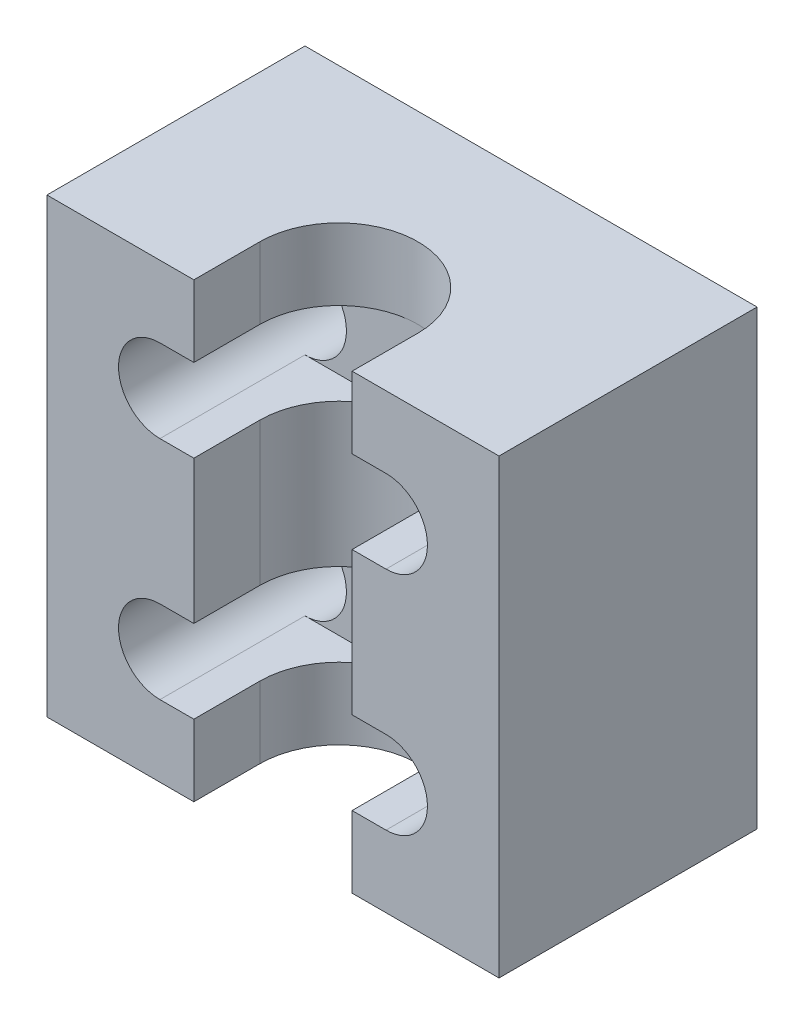
ISO-10303-21;
HEADER;
FILE_DESCRIPTION(('STEP AP214'),'2;1');
FILE_NAME('part.step','',(''),(''),'','','');
FILE_SCHEMA(('AUTOMOTIVE_DESIGN { 1 0 10303 214 1 1 1 1 }'));
ENDSEC;
DATA;
#1=APPLICATION_CONTEXT('core data for automotive mechanical design processes');
#2=APPLICATION_PROTOCOL_DEFINITION('international standard','automotive_design',2000,#1);
#3=PRODUCT_CONTEXT('',#1,'mechanical');
#4=PRODUCT('Part','Part','',(#3));
#5=PRODUCT_RELATED_PRODUCT_CATEGORY('part','',(#4));
#6=PRODUCT_DEFINITION_FORMATION('','',#4);
#7=PRODUCT_DEFINITION_CONTEXT('part definition',#1,'design');
#8=PRODUCT_DEFINITION('design','',#6,#7);
#9=PRODUCT_DEFINITION_SHAPE('','',#8);
#10=(LENGTH_UNIT() NAMED_UNIT(*) SI_UNIT(.MILLI.,.METRE.));
#11=(NAMED_UNIT(*) PLANE_ANGLE_UNIT() SI_UNIT($,.RADIAN.));
#12=(NAMED_UNIT(*) SI_UNIT($,.STERADIAN.) SOLID_ANGLE_UNIT());
#13=UNCERTAINTY_MEASURE_WITH_UNIT(LENGTH_MEASURE(1.E-05),#10,'distance_accuracy_value','');
#14=(GEOMETRIC_REPRESENTATION_CONTEXT(3) GLOBAL_UNCERTAINTY_ASSIGNED_CONTEXT((#13)) GLOBAL_UNIT_ASSIGNED_CONTEXT((#10,
#11,#12)) REPRESENTATION_CONTEXT('',''));
#15=CARTESIAN_POINT('',(0.,0.,0.));
#16=DIRECTION('',(0.,0.,1.));
#17=DIRECTION('',(1.,0.,0.));
#18=AXIS2_PLACEMENT_3D('',#15,#16,#17);
#19=CARTESIAN_POINT('',(25.5233260785874,-2.7,15.7));
#20=DIRECTION('',(0.,0.,1.));
#21=DIRECTION('',(1.,0.,0.));
#22=AXIS2_PLACEMENT_3D('',#19,#20,#21);
#23=PLANE('',#22);
#24=CARTESIAN_POINT('',(-6.,6.,15.7));
#25=DIRECTION('',(0.,0.,1.));
#26=DIRECTION('',(1.,0.,0.));
#27=AXIS2_PLACEMENT_3D('',#24,#25,#26);
#28=CIRCLE('',#27,2.2);
#29=CARTESIAN_POINT('',(-6.,8.2,15.7));
#30=VERTEX_POINT('',#29);
#31=CARTESIAN_POINT('',(-6.,3.8,15.7));
#32=VERTEX_POINT('',#31);
#33=EDGE_CURVE('E391',#30,#32,#28,.T.);
#34=ORIENTED_EDGE('',*,*,#33,.F.);
#35=DIRECTION('',(-1.,0.,0.));
#36=VECTOR('',#35,1.);
#37=CARTESIAN_POINT('',(6.,8.2,15.7));
#38=LINE('',#37,#36);
#39=CARTESIAN_POINT('',(-4.2,8.2,15.7));
#40=VERTEX_POINT('',#39);
#41=EDGE_CURVE('E283',#40,#30,#38,.T.);
#42=ORIENTED_EDGE('',*,*,#41,.F.);
#43=DIRECTION('',(0.,1.,0.));
#44=VECTOR('',#43,1.);
#45=CARTESIAN_POINT('',(-4.2,-12.001,15.7));
#46=LINE('',#45,#44);
#47=CARTESIAN_POINT('',(-4.2,12.,15.7));
#48=VERTEX_POINT('',#47);
#49=EDGE_CURVE('E74',#40,#48,#46,.T.);
#50=ORIENTED_EDGE('',*,*,#49,.T.);
#51=DIRECTION('',(1.,0.,0.));
#52=VECTOR('',#51,1.);
#53=CARTESIAN_POINT('',(-12.,12.,15.7));
#54=LINE('',#53,#52);
#55=CARTESIAN_POINT('',(-12.,12.,15.7));
#56=VERTEX_POINT('',#55);
#57=EDGE_CURVE('E338',#56,#48,#54,.T.);
#58=ORIENTED_EDGE('',*,*,#57,.F.);
#59=DIRECTION('',(0.,-1.,0.));
#60=VECTOR('',#59,1.);
#61=CARTESIAN_POINT('',(-12.,-10.7,15.7));
#62=LINE('',#61,#60);
#63=CARTESIAN_POINT('',(-12.,-12.,15.7));
#64=VERTEX_POINT('',#63);
#65=EDGE_CURVE('E327',#56,#64,#62,.T.);
#66=ORIENTED_EDGE('',*,*,#65,.T.);
#67=DIRECTION('',(1.,0.,0.));
#68=VECTOR('',#67,1.);
#69=CARTESIAN_POINT('',(12.,-12.,15.7));
#70=LINE('',#69,#68);
#71=CARTESIAN_POINT('',(-4.2,-12.,15.7));
#72=VERTEX_POINT('',#71);
#73=EDGE_CURVE('E331',#64,#72,#70,.T.);
#74=ORIENTED_EDGE('',*,*,#73,.T.);
#75=DIRECTION('',(0.,-1.,0.));
#76=VECTOR('',#75,1.);
#77=CARTESIAN_POINT('',(-4.2,12.001,15.7));
#78=LINE('',#77,#76);
#79=CARTESIAN_POINT('',(-4.2,-8.2,15.7));
#80=VERTEX_POINT('',#79);
#81=EDGE_CURVE('E430',#80,#72,#78,.T.);
#82=ORIENTED_EDGE('',*,*,#81,.F.);
#83=DIRECTION('',(1.,0.,0.));
#84=VECTOR('',#83,1.);
#85=CARTESIAN_POINT('',(-6.,-8.2,15.7));
#86=LINE('',#85,#84);
#87=CARTESIAN_POINT('',(-6.,-8.2,15.7));
#88=VERTEX_POINT('',#87);
#89=EDGE_CURVE('E257',#88,#80,#86,.T.);
#90=ORIENTED_EDGE('',*,*,#89,.F.);
#91=CARTESIAN_POINT('',(-6.,-6.,15.7));
#92=DIRECTION('',(0.,0.,-1.));
#93=DIRECTION('',(-1.,0.,0.));
#94=AXIS2_PLACEMENT_3D('',#91,#92,#93);
#95=CIRCLE('',#94,2.2);
#96=CARTESIAN_POINT('',(-6.,-3.8,15.7));
#97=VERTEX_POINT('',#96);
#98=EDGE_CURVE('E411',#88,#97,#95,.T.);
#99=ORIENTED_EDGE('',*,*,#98,.T.);
#100=DIRECTION('',(-1.,0.,0.));
#101=VECTOR('',#100,1.);
#102=CARTESIAN_POINT('',(-4.2,-3.8,15.7));
#103=LINE('',#102,#101);
#104=CARTESIAN_POINT('',(-4.2,-3.8,15.7));
#105=VERTEX_POINT('',#104);
#106=EDGE_CURVE('E252',#105,#97,#103,.T.);
#107=ORIENTED_EDGE('',*,*,#106,.F.);
#108=DIRECTION('',(0.,1.,0.));
#109=VECTOR('',#108,1.);
#110=CARTESIAN_POINT('',(-4.2,28.9536257995575,15.7));
#111=LINE('',#110,#109);
#112=CARTESIAN_POINT('',(-4.2,3.8,15.7));
#113=VERTEX_POINT('',#112);
#114=EDGE_CURVE('E59',#105,#113,#111,.T.);
#115=ORIENTED_EDGE('',*,*,#114,.T.);
#116=DIRECTION('',(1.,0.,0.));
#117=VECTOR('',#116,1.);
#118=CARTESIAN_POINT('',(4.2,3.8,15.7));
#119=LINE('',#118,#117);
#120=EDGE_CURVE('E281',#32,#113,#119,.T.);
#121=ORIENTED_EDGE('',*,*,#120,.F.);
#122=EDGE_LOOP('',(#34,#42,#50,#58,#66,#74,#82,#90,#99,#107,#115,#121));
#123=FACE_BOUND('',#122,.T.);
#124=ADVANCED_FACE('F50',(#123),#23,.T.);
#125=CARTESIAN_POINT('',(-6.,-8.2,12.2));
#126=DIRECTION('',(0.,-1.,0.));
#127=DIRECTION('',(1.,0.,0.));
#128=AXIS2_PLACEMENT_3D('',#125,#126,#127);
#129=PLANE('',#128);
#130=ORIENTED_EDGE('',*,*,#89,.T.);
#131=DIRECTION('',(0.,0.,1.));
#132=VECTOR('',#131,1.);
#133=CARTESIAN_POINT('',(-4.2,-8.2,15.7));
#134=LINE('',#133,#132);
#135=CARTESIAN_POINT('',(-4.2,-8.19999999999999,12.2));
#136=VERTEX_POINT('',#135);
#137=EDGE_CURVE('E414',#136,#80,#134,.T.);
#138=ORIENTED_EDGE('',*,*,#137,.F.);
#139=CARTESIAN_POINT('',(0.,-8.2,12.2));
#140=DIRECTION('',(0.,-1.,0.));
#141=DIRECTION('',(1.,0.,0.));
#142=AXIS2_PLACEMENT_3D('',#139,#140,#141);
#143=CIRCLE('',#142,4.2);
#144=CARTESIAN_POINT('',(0.,-8.2,8.));
#145=VERTEX_POINT('',#144);
#146=EDGE_CURVE('E427',#145,#136,#143,.F.);
#147=ORIENTED_EDGE('',*,*,#146,.F.);
#148=DIRECTION('',(1.,0.,0.));
#149=VECTOR('',#148,1.);
#150=CARTESIAN_POINT('',(-6.,-8.2,8.));
#151=LINE('',#150,#149);
#152=CARTESIAN_POINT('',(-6.,-8.2,8.));
#153=VERTEX_POINT('',#152);
#154=EDGE_CURVE('E461',#153,#145,#151,.T.);
#155=ORIENTED_EDGE('',*,*,#154,.F.);
#156=DIRECTION('',(0.,0.,1.));
#157=VECTOR('',#156,1.);
#158=CARTESIAN_POINT('',(-6.,-8.2,12.2));
#159=LINE('',#158,#157);
#160=EDGE_CURVE('E251',#153,#88,#159,.T.);
#161=ORIENTED_EDGE('',*,*,#160,.T.);
#162=EDGE_LOOP('',(#130,#138,#147,#155,#161));
#163=FACE_BOUND('',#162,.T.);
#164=ADVANCED_FACE('F482',(#163),#129,.F.);
#165=CARTESIAN_POINT('',(6.,8.2,12.2));
#166=DIRECTION('',(0.,1.,0.));
#167=DIRECTION('',(-1.,0.,0.));
#168=AXIS2_PLACEMENT_3D('',#165,#166,#167);
#169=PLANE('',#168);
#170=CARTESIAN_POINT('',(6.,8.2,15.7));
#171=VERTEX_POINT('',#170);
#172=CARTESIAN_POINT('',(4.2,8.19999999999999,15.7));
#173=VERTEX_POINT('',#172);
#174=EDGE_CURVE('E284',#171,#173,#38,.T.);
#175=ORIENTED_EDGE('',*,*,#174,.T.);
#176=DIRECTION('',(0.,0.,1.));
#177=VECTOR('',#176,1.);
#178=CARTESIAN_POINT('',(4.2,8.2,15.7));
#179=LINE('',#178,#177);
#180=CARTESIAN_POINT('',(4.2,8.19999999999999,12.2));
#181=VERTEX_POINT('',#180);
#182=EDGE_CURVE('E449',#181,#173,#179,.T.);
#183=ORIENTED_EDGE('',*,*,#182,.F.);
#184=CARTESIAN_POINT('',(0.,8.2,12.2));
#185=DIRECTION('',(0.,1.,0.));
#186=DIRECTION('',(-1.,0.,0.));
#187=AXIS2_PLACEMENT_3D('',#184,#185,#186);
#188=CIRCLE('',#187,4.2);
#189=CARTESIAN_POINT('',(0.,8.2,8.00000000000001));
#190=VERTEX_POINT('',#189);
#191=EDGE_CURVE('E451',#190,#181,#188,.F.);
#192=ORIENTED_EDGE('',*,*,#191,.F.);
#193=DIRECTION('',(-1.,0.,0.));
#194=VECTOR('',#193,1.);
#195=CARTESIAN_POINT('',(6.,8.2,8.));
#196=LINE('',#195,#194);
#197=CARTESIAN_POINT('',(6.,8.2,8.));
#198=VERTEX_POINT('',#197);
#199=EDGE_CURVE('E274',#198,#190,#196,.T.);
#200=ORIENTED_EDGE('',*,*,#199,.F.);
#201=DIRECTION('',(0.,0.,1.));
#202=VECTOR('',#201,1.);
#203=CARTESIAN_POINT('',(6.,8.2,12.2));
#204=LINE('',#203,#202);
#205=EDGE_CURVE('E291',#198,#171,#204,.T.);
#206=ORIENTED_EDGE('',*,*,#205,.T.);
#207=EDGE_LOOP('',(#175,#183,#192,#200,#206));
#208=FACE_BOUND('',#207,.T.);
#209=ADVANCED_FACE('F587',(#208),#169,.F.);
#210=CARTESIAN_POINT('',(0.,28.9536257995575,12.2));
#211=DIRECTION('',(0.,-1.,0.));
#212=DIRECTION('',(0.,0.,-1.));
#213=AXIS2_PLACEMENT_3D('',#210,#211,#212);
#214=CYLINDRICAL_SURFACE('',#213,4.2);
#215=DIRECTION('',(0.,-1.,0.));
#216=VECTOR('',#215,1.);
#217=CARTESIAN_POINT('',(-4.2,28.9536257995575,12.2));
#218=LINE('',#217,#216);
#219=CARTESIAN_POINT('',(-4.2,3.8,12.2));
#220=VERTEX_POINT('',#219);
#221=CARTESIAN_POINT('',(-4.2,-3.8,12.2));
#222=VERTEX_POINT('',#221);
#223=EDGE_CURVE('E350',#220,#222,#218,.T.);
#224=ORIENTED_EDGE('',*,*,#223,.T.);
#225=CARTESIAN_POINT('',(0.,-3.8,12.2));
#226=DIRECTION('',(0.,1.,0.));
#227=DIRECTION('',(0.,0.,1.));
#228=AXIS2_PLACEMENT_3D('',#225,#226,#227);
#229=CIRCLE('',#228,4.2);
#230=CARTESIAN_POINT('',(0.,-3.8,8.));
#231=VERTEX_POINT('',#230);
#232=EDGE_CURVE('E467',#222,#231,#229,.F.);
#233=ORIENTED_EDGE('',*,*,#232,.T.);
#234=CARTESIAN_POINT('',(0.,-3.8,12.2));
#235=DIRECTION('',(0.,-1.,0.));
#236=DIRECTION('',(0.,0.,-1.));
#237=AXIS2_PLACEMENT_3D('',#234,#235,#236);
#238=CIRCLE('',#237,4.2);
#239=CARTESIAN_POINT('',(4.2,-3.8,12.2));
#240=VERTEX_POINT('',#239);
#241=EDGE_CURVE('E300',#240,#231,#238,.F.);
#242=ORIENTED_EDGE('',*,*,#241,.F.);
#243=DIRECTION('',(0.,-1.,0.));
#244=VECTOR('',#243,1.);
#245=CARTESIAN_POINT('',(4.2,28.9536257995575,12.2));
#246=LINE('',#245,#244);
#247=CARTESIAN_POINT('',(4.2,3.8,12.2));
#248=VERTEX_POINT('',#247);
#249=EDGE_CURVE('E346',#248,#240,#246,.T.);
#250=ORIENTED_EDGE('',*,*,#249,.F.);
#251=CARTESIAN_POINT('',(0.,3.8,12.2));
#252=DIRECTION('',(0.,-1.,0.));
#253=DIRECTION('',(0.,0.,-1.));
#254=AXIS2_PLACEMENT_3D('',#251,#252,#253);
#255=CIRCLE('',#254,4.2);
#256=CARTESIAN_POINT('',(0.,3.8,8.));
#257=VERTEX_POINT('',#256);
#258=EDGE_CURVE('E306',#248,#257,#255,.F.);
#259=ORIENTED_EDGE('',*,*,#258,.T.);
#260=CARTESIAN_POINT('',(0.,3.8,12.2));
#261=DIRECTION('',(0.,-1.,0.));
#262=DIRECTION('',(0.,0.,-1.));
#263=AXIS2_PLACEMENT_3D('',#260,#261,#262);
#264=CIRCLE('',#263,4.2);
#265=EDGE_CURVE('E277',#257,#220,#264,.F.);
#266=ORIENTED_EDGE('',*,*,#265,.T.);
#267=EDGE_LOOP('',(#224,#233,#242,#250,#259,#266));
#268=FACE_BOUND('',#267,.T.);
#269=ADVANCED_FACE('F513',(#268),#214,.F.);
#270=CARTESIAN_POINT('',(4.2,28.9536257995575,12.2));
#271=DIRECTION('',(1.,0.,0.));
#272=DIRECTION('',(0.,0.,-1.));
#273=AXIS2_PLACEMENT_3D('',#270,#271,#272);
#274=PLANE('',#273);
#275=DIRECTION('',(0.,0.,-1.));
#276=VECTOR('',#275,1.);
#277=CARTESIAN_POINT('',(4.2,-3.8,12.2));
#278=LINE('',#277,#276);
#279=CARTESIAN_POINT('',(4.2,-3.8,15.7));
#280=VERTEX_POINT('',#279);
#281=EDGE_CURVE('E303',#280,#240,#278,.T.);
#282=ORIENTED_EDGE('',*,*,#281,.F.);
#283=DIRECTION('',(0.,-1.,0.));
#284=VECTOR('',#283,1.);
#285=CARTESIAN_POINT('',(4.2,28.9536257995575,15.7));
#286=LINE('',#285,#284);
#287=CARTESIAN_POINT('',(4.2,3.8,15.7));
#288=VERTEX_POINT('',#287);
#289=EDGE_CURVE('E250',#288,#280,#286,.T.);
#290=ORIENTED_EDGE('',*,*,#289,.F.);
#291=DIRECTION('',(0.,0.,-1.));
#292=VECTOR('',#291,1.);
#293=CARTESIAN_POINT('',(4.2,3.8,12.2));
#294=LINE('',#293,#292);
#295=EDGE_CURVE('E314',#288,#248,#294,.T.);
#296=ORIENTED_EDGE('',*,*,#295,.T.);
#297=ORIENTED_EDGE('',*,*,#249,.T.);
#298=EDGE_LOOP('',(#282,#290,#296,#297));
#299=FACE_BOUND('',#298,.T.);
#300=ADVANCED_FACE('F586',(#299),#274,.F.);
#301=CARTESIAN_POINT('',(-4.2,28.9536257995575,12.2));
#302=DIRECTION('',(-1.,0.,0.));
#303=DIRECTION('',(0.,0.,1.));
#304=AXIS2_PLACEMENT_3D('',#301,#302,#303);
#305=PLANE('',#304);
#306=DIRECTION('',(0.,0.,1.));
#307=VECTOR('',#306,1.);
#308=CARTESIAN_POINT('',(-4.2,-3.8,12.2));
#309=LINE('',#308,#307);
#310=EDGE_CURVE('E290',#222,#105,#309,.T.);
#311=ORIENTED_EDGE('',*,*,#310,.F.);
#312=ORIENTED_EDGE('',*,*,#223,.F.);
#313=DIRECTION('',(0.,0.,1.));
#314=VECTOR('',#313,1.);
#315=CARTESIAN_POINT('',(-4.2,3.8,12.2));
#316=LINE('',#315,#314);
#317=EDGE_CURVE('E310',#220,#113,#316,.T.);
#318=ORIENTED_EDGE('',*,*,#317,.T.);
#319=ORIENTED_EDGE('',*,*,#114,.F.);
#320=EDGE_LOOP('',(#311,#312,#318,#319));
#321=FACE_BOUND('',#320,.T.);
#322=ADVANCED_FACE('F383',(#321),#305,.F.);
#323=CARTESIAN_POINT('',(6.,-6.,15.7));
#324=DIRECTION('',(0.,0.,1.));
#325=DIRECTION('',(1.,0.,0.));
#326=AXIS2_PLACEMENT_3D('',#323,#324,#325);
#327=CIRCLE('',#326,2.2);
#328=CARTESIAN_POINT('',(6.,-8.2,15.7));
#329=VERTEX_POINT('',#328);
#330=CARTESIAN_POINT('',(6.,-3.8,15.7));
#331=VERTEX_POINT('',#330);
#332=EDGE_CURVE('E224',#329,#331,#327,.T.);
#333=ORIENTED_EDGE('',*,*,#332,.F.);
#334=CARTESIAN_POINT('',(4.2,-8.2,15.7));
#335=VERTEX_POINT('',#334);
#336=EDGE_CURVE('E470',#335,#329,#86,.T.);
#337=ORIENTED_EDGE('',*,*,#336,.F.);
#338=DIRECTION('',(0.,-1.,0.));
#339=VECTOR('',#338,1.);
#340=CARTESIAN_POINT('',(4.2,12.001,15.7));
#341=LINE('',#340,#339);
#342=CARTESIAN_POINT('',(4.2,-12.,15.7));
#343=VERTEX_POINT('',#342);
#344=EDGE_CURVE('E66',#335,#343,#341,.T.);
#345=ORIENTED_EDGE('',*,*,#344,.T.);
#346=CARTESIAN_POINT('',(12.,-12.,15.7));
#347=VERTEX_POINT('',#346);
#348=EDGE_CURVE('E330',#343,#347,#70,.T.);
#349=ORIENTED_EDGE('',*,*,#348,.T.);
#350=DIRECTION('',(0.,-1.,0.));
#351=VECTOR('',#350,1.);
#352=CARTESIAN_POINT('',(12.,12.,15.7));
#353=LINE('',#352,#351);
#354=CARTESIAN_POINT('',(12.,12.,15.7));
#355=VERTEX_POINT('',#354);
#356=EDGE_CURVE('E342',#355,#347,#353,.T.);
#357=ORIENTED_EDGE('',*,*,#356,.F.);
#358=CARTESIAN_POINT('',(4.2,12.,15.7));
#359=VERTEX_POINT('',#358);
#360=EDGE_CURVE('E337',#359,#355,#54,.T.);
#361=ORIENTED_EDGE('',*,*,#360,.F.);
#362=DIRECTION('',(0.,1.,0.));
#363=VECTOR('',#362,1.);
#364=CARTESIAN_POINT('',(4.2,-12.001,15.7));
#365=LINE('',#364,#363);
#366=EDGE_CURVE('E436',#173,#359,#365,.T.);
#367=ORIENTED_EDGE('',*,*,#366,.F.);
#368=ORIENTED_EDGE('',*,*,#174,.F.);
#369=CARTESIAN_POINT('',(6.,6.,15.7));
#370=DIRECTION('',(0.,0.,-1.));
#371=DIRECTION('',(-1.,0.,0.));
#372=AXIS2_PLACEMENT_3D('',#369,#370,#371);
#373=CIRCLE('',#372,2.2);
#374=CARTESIAN_POINT('',(6.,3.8,15.7));
#375=VERTEX_POINT('',#374);
#376=EDGE_CURVE('E405',#171,#375,#373,.T.);
#377=ORIENTED_EDGE('',*,*,#376,.T.);
#378=EDGE_CURVE('E280',#288,#375,#119,.T.);
#379=ORIENTED_EDGE('',*,*,#378,.F.);
#380=ORIENTED_EDGE('',*,*,#289,.T.);
#381=EDGE_CURVE('E239',#331,#280,#103,.T.);
#382=ORIENTED_EDGE('',*,*,#381,.F.);
#383=EDGE_LOOP('',(#333,#337,#345,#349,#357,#361,#367,#368,#377,#379,#380,#382));
#384=FACE_BOUND('',#383,.T.);
#385=ADVANCED_FACE('F247',(#384),#23,.T.);
#386=CARTESIAN_POINT('',(-12.,-12.,16.));
#387=DIRECTION('',(-1.,0.,0.));
#388=DIRECTION('',(0.,-1.,0.));
#389=AXIS2_PLACEMENT_3D('',#386,#387,#388);
#390=PLANE('',#389);
#391=DIRECTION('',(0.,1.,0.));
#392=VECTOR('',#391,1.);
#393=CARTESIAN_POINT('',(-12.,-60.,2.));
#394=LINE('',#393,#392);
#395=CARTESIAN_POINT('',(-12.,-12.,2.00000000000001));
#396=VERTEX_POINT('',#395);
#397=CARTESIAN_POINT('',(-12.,12.,2.));
#398=VERTEX_POINT('',#397);
#399=EDGE_CURVE('E318',#396,#398,#394,.T.);
#400=ORIENTED_EDGE('',*,*,#399,.F.);
#401=DIRECTION('',(0.,0.,-1.));
#402=VECTOR('',#401,1.);
#403=CARTESIAN_POINT('',(-12.,-12.,16.));
#404=LINE('',#403,#402);
#405=EDGE_CURVE('E354',#64,#396,#404,.T.);
#406=ORIENTED_EDGE('',*,*,#405,.F.);
#407=ORIENTED_EDGE('',*,*,#65,.F.);
#408=DIRECTION('',(0.,0.,-1.));
#409=VECTOR('',#408,1.);
#410=CARTESIAN_POINT('',(-12.,12.,16.));
#411=LINE('',#410,#409);
#412=EDGE_CURVE('E366',#56,#398,#411,.T.);
#413=ORIENTED_EDGE('',*,*,#412,.T.);
#414=EDGE_LOOP('',(#400,#406,#407,#413));
#415=FACE_BOUND('',#414,.T.);
#416=ADVANCED_FACE('F52',(#415),#390,.T.);
#417=CARTESIAN_POINT('',(-12.,12.,16.));
#418=DIRECTION('',(0.,1.,0.));
#419=DIRECTION('',(-1.,0.,0.));
#420=AXIS2_PLACEMENT_3D('',#417,#418,#419);
#421=PLANE('',#420);
#422=DIRECTION('',(0.,0.,-1.));
#423=VECTOR('',#422,1.);
#424=CARTESIAN_POINT('',(4.2,12.,15.7));
#425=LINE('',#424,#423);
#426=CARTESIAN_POINT('',(4.2,12.,12.2));
#427=VERTEX_POINT('',#426);
#428=EDGE_CURVE('E444',#359,#427,#425,.T.);
#429=ORIENTED_EDGE('',*,*,#428,.F.);
#430=ORIENTED_EDGE('',*,*,#360,.T.);
#431=DIRECTION('',(0.,0.,-1.));
#432=VECTOR('',#431,1.);
#433=CARTESIAN_POINT('',(12.,12.,16.));
#434=LINE('',#433,#432);
#435=CARTESIAN_POINT('',(12.,12.,2.));
#436=VERTEX_POINT('',#435);
#437=EDGE_CURVE('E362',#355,#436,#434,.T.);
#438=ORIENTED_EDGE('',*,*,#437,.T.);
#439=DIRECTION('',(1.,0.,0.));
#440=VECTOR('',#439,1.);
#441=CARTESIAN_POINT('',(-12.,12.,2.));
#442=LINE('',#441,#440);
#443=EDGE_CURVE('E324',#398,#436,#442,.T.);
#444=ORIENTED_EDGE('',*,*,#443,.F.);
#445=ORIENTED_EDGE('',*,*,#412,.F.);
#446=ORIENTED_EDGE('',*,*,#57,.T.);
#447=DIRECTION('',(0.,0.,1.));
#448=VECTOR('',#447,1.);
#449=CARTESIAN_POINT('',(-4.2,12.,12.2));
#450=LINE('',#449,#448);
#451=CARTESIAN_POINT('',(-4.2,12.,12.2));
#452=VERTEX_POINT('',#451);
#453=EDGE_CURVE('E447',#452,#48,#450,.T.);
#454=ORIENTED_EDGE('',*,*,#453,.F.);
#455=CARTESIAN_POINT('',(0.,12.,12.2));
#456=DIRECTION('',(0.,1.,0.));
#457=DIRECTION('',(-1.,0.,0.));
#458=AXIS2_PLACEMENT_3D('',#455,#456,#457);
#459=CIRCLE('',#458,4.2);
#460=EDGE_CURVE('E439',#427,#452,#459,.T.);
#461=ORIENTED_EDGE('',*,*,#460,.F.);
#462=EDGE_LOOP('',(#429,#430,#438,#444,#445,#446,#454,#461));
#463=FACE_BOUND('',#462,.T.);
#464=ADVANCED_FACE('F532',(#463),#421,.T.);
#465=CARTESIAN_POINT('',(12.,12.,16.));
#466=DIRECTION('',(1.,0.,0.));
#467=DIRECTION('',(0.,1.,0.));
#468=AXIS2_PLACEMENT_3D('',#465,#466,#467);
#469=PLANE('',#468);
#470=DIRECTION('',(0.,-1.,0.));
#471=VECTOR('',#470,1.);
#472=CARTESIAN_POINT('',(12.,12.,2.));
#473=LINE('',#472,#471);
#474=CARTESIAN_POINT('',(12.,-12.,2.));
#475=VERTEX_POINT('',#474);
#476=EDGE_CURVE('E321',#436,#475,#473,.T.);
#477=ORIENTED_EDGE('',*,*,#476,.F.);
#478=ORIENTED_EDGE('',*,*,#437,.F.);
#479=ORIENTED_EDGE('',*,*,#356,.T.);
#480=DIRECTION('',(0.,0.,-1.));
#481=VECTOR('',#480,1.);
#482=CARTESIAN_POINT('',(12.,-12.,16.));
#483=LINE('',#482,#481);
#484=EDGE_CURVE('E358',#347,#475,#483,.T.);
#485=ORIENTED_EDGE('',*,*,#484,.T.);
#486=EDGE_LOOP('',(#477,#478,#479,#485));
#487=FACE_BOUND('',#486,.T.);
#488=ADVANCED_FACE('F542',(#487),#469,.T.);
#489=CARTESIAN_POINT('',(12.,-12.,16.));
#490=DIRECTION('',(0.,-1.,0.));
#491=DIRECTION('',(0.,0.,-1.));
#492=AXIS2_PLACEMENT_3D('',#489,#490,#491);
#493=PLANE('',#492);
#494=DIRECTION('',(0.,0.,-1.));
#495=VECTOR('',#494,1.);
#496=CARTESIAN_POINT('',(-4.2,-12.,15.7));
#497=LINE('',#496,#495);
#498=CARTESIAN_POINT('',(-4.2,-12.,12.2));
#499=VERTEX_POINT('',#498);
#500=EDGE_CURVE('E416',#72,#499,#497,.T.);
#501=ORIENTED_EDGE('',*,*,#500,.F.);
#502=ORIENTED_EDGE('',*,*,#73,.F.);
#503=ORIENTED_EDGE('',*,*,#405,.T.);
#504=DIRECTION('',(-1.,0.,0.));
#505=VECTOR('',#504,1.);
#506=CARTESIAN_POINT('',(12.,-12.,2.));
#507=LINE('',#506,#505);
#508=EDGE_CURVE('E11',#475,#396,#507,.T.);
#509=ORIENTED_EDGE('',*,*,#508,.F.);
#510=ORIENTED_EDGE('',*,*,#484,.F.);
#511=ORIENTED_EDGE('',*,*,#348,.F.);
#512=DIRECTION('',(0.,0.,1.));
#513=VECTOR('',#512,1.);
#514=CARTESIAN_POINT('',(4.2,-12.,12.2));
#515=LINE('',#514,#513);
#516=CARTESIAN_POINT('',(4.2,-12.,12.2));
#517=VERTEX_POINT('',#516);
#518=EDGE_CURVE('E418',#517,#343,#515,.T.);
#519=ORIENTED_EDGE('',*,*,#518,.F.);
#520=CARTESIAN_POINT('',(0.,-12.,12.2));
#521=DIRECTION('',(0.,-1.,0.));
#522=DIRECTION('',(0.,0.,-1.));
#523=AXIS2_PLACEMENT_3D('',#520,#521,#522);
#524=CIRCLE('',#523,4.2);
#525=EDGE_CURVE('E421',#499,#517,#524,.T.);
#526=ORIENTED_EDGE('',*,*,#525,.F.);
#527=EDGE_LOOP('',(#501,#502,#503,#509,#510,#511,#519,#526));
#528=FACE_BOUND('',#527,.T.);
#529=ADVANCED_FACE('F493',(#528),#493,.T.);
#530=CARTESIAN_POINT('',(111.37945534002,-60.,2.));
#531=DIRECTION('',(0.,0.,1.));
#532=DIRECTION('',(0.,-1.,0.));
#533=AXIS2_PLACEMENT_3D('',#530,#531,#532);
#534=PLANE('',#533);
#535=CARTESIAN_POINT('',(6.,-6.,2.));
#536=DIRECTION('',(0.,0.,1.));
#537=DIRECTION('',(1.,0.,0.));
#538=AXIS2_PLACEMENT_3D('',#535,#536,#537);
#539=CIRCLE('',#538,2.2);
#540=CARTESIAN_POINT('',(8.2,-6.,2.));
#541=VERTEX_POINT('',#540);
#542=EDGE_CURVE('E235',#541,#541,#539,.T.);
#543=ORIENTED_EDGE('',*,*,#542,.T.);
#544=EDGE_LOOP('',(#543));
#545=FACE_BOUND('',#544,.T.);
#546=CARTESIAN_POINT('',(-6.,6.,2.));
#547=DIRECTION('',(0.,0.,1.));
#548=DIRECTION('',(1.,0.,0.));
#549=AXIS2_PLACEMENT_3D('',#546,#547,#548);
#550=CIRCLE('',#549,2.2);
#551=CARTESIAN_POINT('',(-3.8,6.,2.));
#552=VERTEX_POINT('',#551);
#553=EDGE_CURVE('E395',#552,#552,#550,.T.);
#554=ORIENTED_EDGE('',*,*,#553,.T.);
#555=EDGE_LOOP('',(#554));
#556=FACE_BOUND('',#555,.T.);
#557=CARTESIAN_POINT('',(6.,6.,2.));
#558=DIRECTION('',(0.,0.,-1.));
#559=DIRECTION('',(-1.,0.,0.));
#560=AXIS2_PLACEMENT_3D('',#557,#558,#559);
#561=CIRCLE('',#560,2.2);
#562=CARTESIAN_POINT('',(3.8,6.,2.));
#563=VERTEX_POINT('',#562);
#564=EDGE_CURVE('E398',#563,#563,#561,.T.);
#565=ORIENTED_EDGE('',*,*,#564,.F.);
#566=EDGE_LOOP('',(#565));
#567=FACE_BOUND('',#566,.T.);
#568=CARTESIAN_POINT('',(-6.,-6.,2.));
#569=DIRECTION('',(0.,0.,-1.));
#570=DIRECTION('',(-1.,0.,0.));
#571=AXIS2_PLACEMENT_3D('',#568,#569,#570);
#572=CIRCLE('',#571,2.2);
#573=CARTESIAN_POINT('',(-8.2,-6.,2.));
#574=VERTEX_POINT('',#573);
#575=EDGE_CURVE('E408',#574,#574,#572,.T.);
#576=ORIENTED_EDGE('',*,*,#575,.F.);
#577=EDGE_LOOP('',(#576));
#578=FACE_BOUND('',#577,.T.);
#579=ORIENTED_EDGE('',*,*,#443,.T.);
#580=ORIENTED_EDGE('',*,*,#476,.T.);
#581=ORIENTED_EDGE('',*,*,#508,.T.);
#582=ORIENTED_EDGE('',*,*,#399,.T.);
#583=EDGE_LOOP('',(#579,#580,#581,#582));
#584=FACE_BOUND('',#583,.T.);
#585=ADVANCED_FACE('F618',(#545,#556,#567,#578,#584),#534,.F.);
#586=CARTESIAN_POINT('',(4.2,3.8,12.2));
#587=DIRECTION('',(0.,-1.,0.));
#588=DIRECTION('',(0.,0.,-1.));
#589=AXIS2_PLACEMENT_3D('',#586,#587,#588);
#590=PLANE('',#589);
#591=ORIENTED_EDGE('',*,*,#378,.T.);
#592=DIRECTION('',(0.,0.,1.));
#593=VECTOR('',#592,1.);
#594=CARTESIAN_POINT('',(6.,3.8,12.2));
#595=LINE('',#594,#593);
#596=CARTESIAN_POINT('',(6.,3.8,8.));
#597=VERTEX_POINT('',#596);
#598=EDGE_CURVE('E294',#597,#375,#595,.T.);
#599=ORIENTED_EDGE('',*,*,#598,.F.);
#600=DIRECTION('',(1.,0.,0.));
#601=VECTOR('',#600,1.);
#602=CARTESIAN_POINT('',(-6.,3.8,8.));
#603=LINE('',#602,#601);
#604=EDGE_CURVE('E266',#257,#597,#603,.T.);
#605=ORIENTED_EDGE('',*,*,#604,.F.);
#606=ORIENTED_EDGE('',*,*,#258,.F.);
#607=ORIENTED_EDGE('',*,*,#295,.F.);
#608=EDGE_LOOP('',(#591,#599,#605,#606,#607));
#609=FACE_BOUND('',#608,.T.);
#610=ADVANCED_FACE('F517',(#609),#590,.F.);
#611=ORIENTED_EDGE('',*,*,#317,.F.);
#612=ORIENTED_EDGE('',*,*,#265,.F.);
#613=CARTESIAN_POINT('',(-6.,3.8,8.));
#614=VERTEX_POINT('',#613);
#615=EDGE_CURVE('E267',#614,#257,#603,.T.);
#616=ORIENTED_EDGE('',*,*,#615,.F.);
#617=DIRECTION('',(0.,0.,1.));
#618=VECTOR('',#617,1.);
#619=CARTESIAN_POINT('',(-6.,3.8,12.2));
#620=LINE('',#619,#618);
#621=EDGE_CURVE('E287',#614,#32,#620,.T.);
#622=ORIENTED_EDGE('',*,*,#621,.T.);
#623=ORIENTED_EDGE('',*,*,#120,.T.);
#624=EDGE_LOOP('',(#611,#612,#616,#622,#623));
#625=FACE_BOUND('',#624,.T.);
#626=ADVANCED_FACE('F385',(#625),#590,.F.);
#627=CARTESIAN_POINT('',(-6.,8.2,8.));
#628=VERTEX_POINT('',#627);
#629=EDGE_CURVE('E273',#190,#628,#196,.T.);
#630=ORIENTED_EDGE('',*,*,#629,.F.);
#631=CARTESIAN_POINT('',(-4.2,8.19999999999999,12.2));
#632=VERTEX_POINT('',#631);
#633=EDGE_CURVE('E452',#632,#190,#188,.F.);
#634=ORIENTED_EDGE('',*,*,#633,.F.);
#635=DIRECTION('',(0.,0.,-1.));
#636=VECTOR('',#635,1.);
#637=CARTESIAN_POINT('',(-4.2,8.2,12.2));
#638=LINE('',#637,#636);
#639=EDGE_CURVE('E434',#40,#632,#638,.T.);
#640=ORIENTED_EDGE('',*,*,#639,.F.);
#641=ORIENTED_EDGE('',*,*,#41,.T.);
#642=DIRECTION('',(0.,0.,1.));
#643=VECTOR('',#642,1.);
#644=CARTESIAN_POINT('',(-6.,8.2,12.2));
#645=LINE('',#644,#643);
#646=EDGE_CURVE('E288',#628,#30,#645,.T.);
#647=ORIENTED_EDGE('',*,*,#646,.F.);
#648=EDGE_LOOP('',(#630,#634,#640,#641,#647));
#649=FACE_BOUND('',#648,.T.);
#650=ADVANCED_FACE('F526',(#649),#169,.F.);
#651=CARTESIAN_POINT('',(-6.,6.,8.));
#652=DIRECTION('',(0.,0.,-1.));
#653=DIRECTION('',(-1.,0.,0.));
#654=AXIS2_PLACEMENT_3D('',#651,#652,#653);
#655=PLANE('',#654);
#656=CARTESIAN_POINT('',(-6.,6.,8.));
#657=DIRECTION('',(0.,0.,-1.));
#658=DIRECTION('',(-1.,0.,0.));
#659=AXIS2_PLACEMENT_3D('',#656,#657,#658);
#660=CIRCLE('',#659,2.2);
#661=EDGE_CURVE('E261',#628,#614,#660,.T.);
#662=ORIENTED_EDGE('',*,*,#661,.T.);
#663=ORIENTED_EDGE('',*,*,#615,.T.);
#664=ORIENTED_EDGE('',*,*,#604,.T.);
#665=CARTESIAN_POINT('',(6.,6.,8.));
#666=DIRECTION('',(0.,0.,-1.));
#667=DIRECTION('',(-1.,0.,0.));
#668=AXIS2_PLACEMENT_3D('',#665,#666,#667);
#669=CIRCLE('',#668,2.2);
#670=EDGE_CURVE('E270',#597,#198,#669,.T.);
#671=ORIENTED_EDGE('',*,*,#670,.T.);
#672=ORIENTED_EDGE('',*,*,#199,.T.);
#673=ORIENTED_EDGE('',*,*,#629,.T.);
#674=EDGE_LOOP('',(#662,#663,#664,#671,#672,#673));
#675=FACE_BOUND('',#674,.T.);
#676=ADVANCED_FACE('F521',(#675),#655,.F.);
#677=CARTESIAN_POINT('',(-4.2,-3.8,12.2));
#678=DIRECTION('',(0.,1.,0.));
#679=DIRECTION('',(0.,0.,1.));
#680=AXIS2_PLACEMENT_3D('',#677,#678,#679);
#681=PLANE('',#680);
#682=ORIENTED_EDGE('',*,*,#281,.T.);
#683=ORIENTED_EDGE('',*,*,#241,.T.);
#684=DIRECTION('',(-1.,0.,0.));
#685=VECTOR('',#684,1.);
#686=CARTESIAN_POINT('',(6.00000000000001,-3.8,8.));
#687=LINE('',#686,#685);
#688=CARTESIAN_POINT('',(6.,-3.8,8.));
#689=VERTEX_POINT('',#688);
#690=EDGE_CURVE('E242',#689,#231,#687,.T.);
#691=ORIENTED_EDGE('',*,*,#690,.F.);
#692=DIRECTION('',(0.,0.,1.));
#693=VECTOR('',#692,1.);
#694=CARTESIAN_POINT('',(6.,-3.8,12.2));
#695=LINE('',#694,#693);
#696=EDGE_CURVE('E227',#689,#331,#695,.T.);
#697=ORIENTED_EDGE('',*,*,#696,.T.);
#698=ORIENTED_EDGE('',*,*,#381,.T.);
#699=EDGE_LOOP('',(#682,#683,#691,#697,#698));
#700=FACE_BOUND('',#699,.T.);
#701=ADVANCED_FACE('F238',(#700),#681,.F.);
#702=ORIENTED_EDGE('',*,*,#106,.T.);
#703=DIRECTION('',(0.,0.,1.));
#704=VECTOR('',#703,1.);
#705=CARTESIAN_POINT('',(-6.,-3.8,12.2));
#706=LINE('',#705,#704);
#707=CARTESIAN_POINT('',(-6.,-3.8,8.));
#708=VERTEX_POINT('',#707);
#709=EDGE_CURVE('E244',#708,#97,#706,.T.);
#710=ORIENTED_EDGE('',*,*,#709,.F.);
#711=EDGE_CURVE('E466',#231,#708,#687,.T.);
#712=ORIENTED_EDGE('',*,*,#711,.F.);
#713=ORIENTED_EDGE('',*,*,#232,.F.);
#714=ORIENTED_EDGE('',*,*,#310,.T.);
#715=EDGE_LOOP('',(#702,#710,#712,#713,#714));
#716=FACE_BOUND('',#715,.T.);
#717=ADVANCED_FACE('F512',(#716),#681,.F.);
#718=CARTESIAN_POINT('',(6.,-8.2,8.));
#719=VERTEX_POINT('',#718);
#720=EDGE_CURVE('E460',#145,#719,#151,.T.);
#721=ORIENTED_EDGE('',*,*,#720,.F.);
#722=CARTESIAN_POINT('',(4.2,-8.19999999999999,12.2));
#723=VERTEX_POINT('',#722);
#724=EDGE_CURVE('E417',#723,#145,#143,.F.);
#725=ORIENTED_EDGE('',*,*,#724,.F.);
#726=DIRECTION('',(0.,0.,-1.));
#727=VECTOR('',#726,1.);
#728=CARTESIAN_POINT('',(4.2,-8.2,12.2));
#729=LINE('',#728,#727);
#730=EDGE_CURVE('E413',#335,#723,#729,.T.);
#731=ORIENTED_EDGE('',*,*,#730,.F.);
#732=ORIENTED_EDGE('',*,*,#336,.T.);
#733=DIRECTION('',(0.,0.,1.));
#734=VECTOR('',#733,1.);
#735=CARTESIAN_POINT('',(6.00000000000001,-8.2,12.2));
#736=LINE('',#735,#734);
#737=EDGE_CURVE('E230',#719,#329,#736,.T.);
#738=ORIENTED_EDGE('',*,*,#737,.F.);
#739=EDGE_LOOP('',(#721,#725,#731,#732,#738));
#740=FACE_BOUND('',#739,.T.);
#741=ADVANCED_FACE('F502',(#740),#129,.F.);
#742=CARTESIAN_POINT('',(-6.,-6.,8.));
#743=DIRECTION('',(0.,0.,-1.));
#744=DIRECTION('',(-1.,0.,0.));
#745=AXIS2_PLACEMENT_3D('',#742,#743,#744);
#746=PLANE('',#745);
#747=CARTESIAN_POINT('',(-6.,-6.,8.));
#748=DIRECTION('',(0.,0.,-1.));
#749=DIRECTION('',(-1.,0.,0.));
#750=AXIS2_PLACEMENT_3D('',#747,#748,#749);
#751=CIRCLE('',#750,2.2);
#752=EDGE_CURVE('E457',#708,#153,#751,.T.);
#753=ORIENTED_EDGE('',*,*,#752,.T.);
#754=ORIENTED_EDGE('',*,*,#154,.T.);
#755=ORIENTED_EDGE('',*,*,#720,.T.);
#756=CARTESIAN_POINT('',(6.,-6.,8.));
#757=DIRECTION('',(0.,0.,-1.));
#758=DIRECTION('',(-1.,0.,0.));
#759=AXIS2_PLACEMENT_3D('',#756,#757,#758);
#760=CIRCLE('',#759,2.2);
#761=EDGE_CURVE('E464',#719,#689,#760,.T.);
#762=ORIENTED_EDGE('',*,*,#761,.T.);
#763=ORIENTED_EDGE('',*,*,#690,.T.);
#764=ORIENTED_EDGE('',*,*,#711,.T.);
#765=EDGE_LOOP('',(#753,#754,#755,#762,#763,#764));
#766=FACE_BOUND('',#765,.T.);
#767=ADVANCED_FACE('F504',(#766),#746,.F.);
#768=CARTESIAN_POINT('',(4.2,-12.001,15.7));
#769=DIRECTION('',(1.,0.,0.));
#770=DIRECTION('',(0.,0.,-1.));
#771=AXIS2_PLACEMENT_3D('',#768,#769,#770);
#772=PLANE('',#771);
#773=ORIENTED_EDGE('',*,*,#182,.T.);
#774=ORIENTED_EDGE('',*,*,#366,.T.);
#775=ORIENTED_EDGE('',*,*,#428,.T.);
#776=DIRECTION('',(0.,1.,0.));
#777=VECTOR('',#776,1.);
#778=CARTESIAN_POINT('',(4.2,-12.001,12.2));
#779=LINE('',#778,#777);
#780=EDGE_CURVE('E438',#181,#427,#779,.T.);
#781=ORIENTED_EDGE('',*,*,#780,.F.);
#782=EDGE_LOOP('',(#773,#774,#775,#781));
#783=FACE_BOUND('',#782,.T.);
#784=ADVANCED_FACE('F950',(#783),#772,.F.);
#785=CARTESIAN_POINT('',(0.,-12.001,12.2));
#786=DIRECTION('',(0.,1.,0.));
#787=DIRECTION('',(-1.,0.,0.));
#788=AXIS2_PLACEMENT_3D('',#785,#786,#787);
#789=CYLINDRICAL_SURFACE('',#788,4.2);
#790=ORIENTED_EDGE('',*,*,#780,.T.);
#791=ORIENTED_EDGE('',*,*,#460,.T.);
#792=DIRECTION('',(0.,1.,0.));
#793=VECTOR('',#792,1.);
#794=CARTESIAN_POINT('',(-4.2,-12.001,12.2));
#795=LINE('',#794,#793);
#796=EDGE_CURVE('E441',#632,#452,#795,.T.);
#797=ORIENTED_EDGE('',*,*,#796,.F.);
#798=ORIENTED_EDGE('',*,*,#633,.T.);
#799=ORIENTED_EDGE('',*,*,#191,.T.);
#800=EDGE_LOOP('',(#790,#791,#797,#798,#799));
#801=FACE_BOUND('',#800,.T.);
#802=ADVANCED_FACE('F1007',(#801),#789,.F.);
#803=CARTESIAN_POINT('',(-4.2,-12.001,12.2));
#804=DIRECTION('',(-1.,0.,0.));
#805=DIRECTION('',(0.,0.,1.));
#806=AXIS2_PLACEMENT_3D('',#803,#804,#805);
#807=PLANE('',#806);
#808=ORIENTED_EDGE('',*,*,#639,.T.);
#809=ORIENTED_EDGE('',*,*,#796,.T.);
#810=ORIENTED_EDGE('',*,*,#453,.T.);
#811=ORIENTED_EDGE('',*,*,#49,.F.);
#812=EDGE_LOOP('',(#808,#809,#810,#811));
#813=FACE_BOUND('',#812,.T.);
#814=ADVANCED_FACE('F1001',(#813),#807,.F.);
#815=CARTESIAN_POINT('',(-4.2,12.001,15.7));
#816=DIRECTION('',(-1.,0.,0.));
#817=DIRECTION('',(0.,0.,1.));
#818=AXIS2_PLACEMENT_3D('',#815,#816,#817);
#819=PLANE('',#818);
#820=ORIENTED_EDGE('',*,*,#137,.T.);
#821=ORIENTED_EDGE('',*,*,#81,.T.);
#822=ORIENTED_EDGE('',*,*,#500,.T.);
#823=DIRECTION('',(0.,-1.,0.));
#824=VECTOR('',#823,1.);
#825=CARTESIAN_POINT('',(-4.2,12.001,12.2));
#826=LINE('',#825,#824);
#827=EDGE_CURVE('E420',#136,#499,#826,.T.);
#828=ORIENTED_EDGE('',*,*,#827,.F.);
#829=EDGE_LOOP('',(#820,#821,#822,#828));
#830=FACE_BOUND('',#829,.T.);
#831=ADVANCED_FACE('F489',(#830),#819,.F.);
#832=CARTESIAN_POINT('',(0.,12.001,12.2));
#833=DIRECTION('',(0.,-1.,0.));
#834=DIRECTION('',(0.,0.,-1.));
#835=AXIS2_PLACEMENT_3D('',#832,#833,#834);
#836=CYLINDRICAL_SURFACE('',#835,4.2);
#837=ORIENTED_EDGE('',*,*,#827,.T.);
#838=ORIENTED_EDGE('',*,*,#525,.T.);
#839=DIRECTION('',(0.,-1.,0.));
#840=VECTOR('',#839,1.);
#841=CARTESIAN_POINT('',(4.2,12.001,12.2));
#842=LINE('',#841,#840);
#843=EDGE_CURVE('E431',#723,#517,#842,.T.);
#844=ORIENTED_EDGE('',*,*,#843,.F.);
#845=ORIENTED_EDGE('',*,*,#724,.T.);
#846=ORIENTED_EDGE('',*,*,#146,.T.);
#847=EDGE_LOOP('',(#837,#838,#844,#845,#846));
#848=FACE_BOUND('',#847,.T.);
#849=ADVANCED_FACE('F498',(#848),#836,.F.);
#850=CARTESIAN_POINT('',(4.2,12.001,12.2));
#851=DIRECTION('',(1.,0.,0.));
#852=DIRECTION('',(0.,0.,-1.));
#853=AXIS2_PLACEMENT_3D('',#850,#851,#852);
#854=PLANE('',#853);
#855=ORIENTED_EDGE('',*,*,#730,.T.);
#856=ORIENTED_EDGE('',*,*,#843,.T.);
#857=ORIENTED_EDGE('',*,*,#518,.T.);
#858=ORIENTED_EDGE('',*,*,#344,.F.);
#859=EDGE_LOOP('',(#855,#856,#857,#858));
#860=FACE_BOUND('',#859,.T.);
#861=ADVANCED_FACE('F981',(#860),#854,.F.);
#862=CARTESIAN_POINT('',(-6.,-6.,15.7));
#863=DIRECTION('',(0.,0.,-1.));
#864=DIRECTION('',(-1.,0.,0.));
#865=AXIS2_PLACEMENT_3D('',#862,#863,#864);
#866=CYLINDRICAL_SURFACE('',#865,2.2);
#867=ORIENTED_EDGE('',*,*,#160,.F.);
#868=ORIENTED_EDGE('',*,*,#752,.F.);
#869=ORIENTED_EDGE('',*,*,#709,.T.);
#870=ORIENTED_EDGE('',*,*,#98,.F.);
#871=EDGE_LOOP('',(#867,#868,#869,#870));
#872=FACE_BOUND('',#871,.T.);
#873=ORIENTED_EDGE('',*,*,#575,.T.);
#874=EDGE_LOOP('',(#873));
#875=FACE_BOUND('',#874,.T.);
#876=ADVANCED_FACE('F509',(#872,#875),#866,.F.);
#877=CARTESIAN_POINT('',(6.,6.,15.7));
#878=DIRECTION('',(0.,0.,-1.));
#879=DIRECTION('',(-1.,0.,0.));
#880=AXIS2_PLACEMENT_3D('',#877,#878,#879);
#881=CYLINDRICAL_SURFACE('',#880,2.2);
#882=ORIENTED_EDGE('',*,*,#205,.F.);
#883=ORIENTED_EDGE('',*,*,#670,.F.);
#884=ORIENTED_EDGE('',*,*,#598,.T.);
#885=ORIENTED_EDGE('',*,*,#376,.F.);
#886=EDGE_LOOP('',(#882,#883,#884,#885));
#887=FACE_BOUND('',#886,.T.);
#888=ORIENTED_EDGE('',*,*,#564,.T.);
#889=EDGE_LOOP('',(#888));
#890=FACE_BOUND('',#889,.T.);
#891=ADVANCED_FACE('F967',(#887,#890),#881,.F.);
#892=CARTESIAN_POINT('',(-6.,6.,2.));
#893=DIRECTION('',(0.,0.,1.));
#894=DIRECTION('',(1.,0.,0.));
#895=AXIS2_PLACEMENT_3D('',#892,#893,#894);
#896=CYLINDRICAL_SURFACE('',#895,2.2);
#897=ORIENTED_EDGE('',*,*,#553,.F.);
#898=EDGE_LOOP('',(#897));
#899=FACE_BOUND('',#898,.T.);
#900=ORIENTED_EDGE('',*,*,#661,.F.);
#901=ORIENTED_EDGE('',*,*,#646,.T.);
#902=ORIENTED_EDGE('',*,*,#33,.T.);
#903=ORIENTED_EDGE('',*,*,#621,.F.);
#904=EDGE_LOOP('',(#900,#901,#902,#903));
#905=FACE_BOUND('',#904,.T.);
#906=ADVANCED_FACE('F389',(#899,#905),#896,.F.);
#907=CARTESIAN_POINT('',(6.,-6.,2.));
#908=DIRECTION('',(0.,0.,1.));
#909=DIRECTION('',(1.,0.,0.));
#910=AXIS2_PLACEMENT_3D('',#907,#908,#909);
#911=CYLINDRICAL_SURFACE('',#910,2.2);
#912=ORIENTED_EDGE('',*,*,#542,.F.);
#913=EDGE_LOOP('',(#912));
#914=FACE_BOUND('',#913,.T.);
#915=ORIENTED_EDGE('',*,*,#761,.F.);
#916=ORIENTED_EDGE('',*,*,#737,.T.);
#917=ORIENTED_EDGE('',*,*,#332,.T.);
#918=ORIENTED_EDGE('',*,*,#696,.F.);
#919=EDGE_LOOP('',(#915,#916,#917,#918));
#920=FACE_BOUND('',#919,.T.);
#921=ADVANCED_FACE('F226',(#914,#920),#911,.F.);
#922=CLOSED_SHELL('',(#124,#164,#209,#269,#300,#322,#385,#416,#464,#488,#529,#585,#610,#626,
#650,#676,#701,#717,#741,#767,#784,#802,#814,#831,#849,#861,#876,#891,#906,#921));
#923=MANIFOLD_SOLID_BREP('B2',#922);
#924=ADVANCED_BREP_SHAPE_REPRESENTATION('',(#18,#923),#14);
#925=SHAPE_DEFINITION_REPRESENTATION(#9,#924);
ENDSEC;
END-ISO-10303-21;
